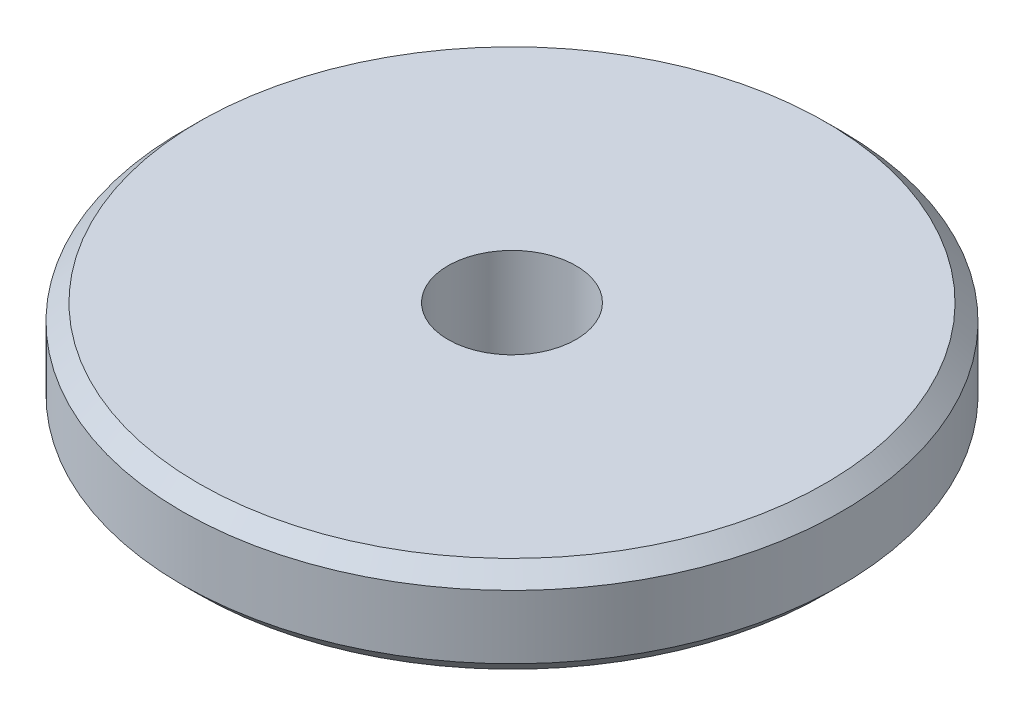
ISO-10303-21;
HEADER;
FILE_DESCRIPTION(('STEP AP214'),'2;1');
FILE_NAME('part.step','',(''),(''),'','','');
FILE_SCHEMA(('AUTOMOTIVE_DESIGN { 1 0 10303 214 1 1 1 1 }'));
ENDSEC;
DATA;
#1=APPLICATION_CONTEXT('core data for automotive mechanical design processes');
#2=APPLICATION_PROTOCOL_DEFINITION('international standard','automotive_design',2000,#1);
#3=PRODUCT_CONTEXT('',#1,'mechanical');
#4=PRODUCT('Part','Part','',(#3));
#5=PRODUCT_RELATED_PRODUCT_CATEGORY('part','',(#4));
#6=PRODUCT_DEFINITION_FORMATION('','',#4);
#7=PRODUCT_DEFINITION_CONTEXT('part definition',#1,'design');
#8=PRODUCT_DEFINITION('design','',#6,#7);
#9=PRODUCT_DEFINITION_SHAPE('','',#8);
#10=(LENGTH_UNIT() NAMED_UNIT(*) SI_UNIT(.MILLI.,.METRE.));
#11=(NAMED_UNIT(*) PLANE_ANGLE_UNIT() SI_UNIT($,.RADIAN.));
#12=(NAMED_UNIT(*) SI_UNIT($,.STERADIAN.) SOLID_ANGLE_UNIT());
#13=UNCERTAINTY_MEASURE_WITH_UNIT(LENGTH_MEASURE(1.E-05),#10,'distance_accuracy_value','');
#14=(GEOMETRIC_REPRESENTATION_CONTEXT(3) GLOBAL_UNCERTAINTY_ASSIGNED_CONTEXT((#13)) GLOBAL_UNIT_ASSIGNED_CONTEXT((#10,
#11,#12)) REPRESENTATION_CONTEXT('',''));
#15=CARTESIAN_POINT('',(0.,0.,0.));
#16=DIRECTION('',(0.,0.,1.));
#17=DIRECTION('',(1.,0.,0.));
#18=AXIS2_PLACEMENT_3D('',#15,#16,#17);
#19=CARTESIAN_POINT('',(0.,1.5,0.));
#20=DIRECTION('',(0.,1.,0.));
#21=DIRECTION('',(0.,0.,1.));
#22=AXIS2_PLACEMENT_3D('',#19,#20,#21);
#23=PLANE('',#22);
#24=CARTESIAN_POINT('',(0.,1.5,0.));
#25=DIRECTION('',(0.,1.,0.));
#26=DIRECTION('',(0.,0.,1.));
#27=AXIS2_PLACEMENT_3D('',#24,#25,#26);
#28=CIRCLE('',#27,4.896);
#29=CARTESIAN_POINT('',(0.,1.5,4.896));
#30=VERTEX_POINT('',#29);
#31=EDGE_CURVE('E57',#30,#30,#28,.T.);
#32=ORIENTED_EDGE('',*,*,#31,.T.);
#33=EDGE_LOOP('',(#32));
#34=FACE_BOUND('',#33,.T.);
#35=CARTESIAN_POINT('',(0.,1.5,0.));
#36=DIRECTION('',(0.,1.,0.));
#37=DIRECTION('',(0.,0.,1.));
#38=AXIS2_PLACEMENT_3D('',#35,#36,#37);
#39=CIRCLE('',#38,1.);
#40=CARTESIAN_POINT('',(0.,1.5,1.));
#41=VERTEX_POINT('',#40);
#42=EDGE_CURVE('E62',#41,#41,#39,.T.);
#43=ORIENTED_EDGE('',*,*,#42,.F.);
#44=EDGE_LOOP('',(#43));
#45=FACE_BOUND('',#44,.T.);
#46=ADVANCED_FACE('F41',(#34,#45),#23,.T.);
#47=CARTESIAN_POINT('',(0.,0.,0.));
#48=DIRECTION('',(0.,1.,0.));
#49=DIRECTION('',(0.,0.,1.));
#50=AXIS2_PLACEMENT_3D('',#47,#48,#49);
#51=PLANE('',#50);
#52=CARTESIAN_POINT('',(0.,0.,0.));
#53=DIRECTION('',(0.,1.,0.));
#54=DIRECTION('',(0.,0.,1.));
#55=AXIS2_PLACEMENT_3D('',#52,#53,#54);
#56=CIRCLE('',#55,4.896);
#57=CARTESIAN_POINT('',(0.,0.,4.896));
#58=VERTEX_POINT('',#57);
#59=EDGE_CURVE('E10',#58,#58,#56,.F.);
#60=ORIENTED_EDGE('',*,*,#59,.T.);
#61=EDGE_LOOP('',(#60));
#62=FACE_BOUND('',#61,.T.);
#63=CARTESIAN_POINT('',(0.,0.,0.));
#64=DIRECTION('',(0.,1.,0.));
#65=DIRECTION('',(0.,0.,1.));
#66=AXIS2_PLACEMENT_3D('',#63,#64,#65);
#67=CIRCLE('',#66,1.);
#68=CARTESIAN_POINT('',(0.,0.,1.));
#69=VERTEX_POINT('',#68);
#70=EDGE_CURVE('E63',#69,#69,#67,.T.);
#71=ORIENTED_EDGE('',*,*,#70,.T.);
#72=EDGE_LOOP('',(#71));
#73=FACE_BOUND('',#72,.T.);
#74=ADVANCED_FACE('F73',(#62,#73),#51,.F.);
#75=CARTESIAN_POINT('',(0.,1.5,0.));
#76=DIRECTION('',(0.,-1.,0.));
#77=DIRECTION('',(0.,0.,-1.));
#78=AXIS2_PLACEMENT_3D('',#75,#76,#77);
#79=CYLINDRICAL_SURFACE('',#78,5.15);
#80=CARTESIAN_POINT('',(0.,1.246,0.));
#81=DIRECTION('',(0.,1.,0.));
#82=DIRECTION('',(0.,0.,1.));
#83=AXIS2_PLACEMENT_3D('',#80,#81,#82);
#84=CIRCLE('',#83,5.15);
#85=CARTESIAN_POINT('',(0.,1.246,5.15));
#86=VERTEX_POINT('',#85);
#87=EDGE_CURVE('E49',#86,#86,#84,.F.);
#88=ORIENTED_EDGE('',*,*,#87,.T.);
#89=EDGE_LOOP('',(#88));
#90=FACE_BOUND('',#89,.T.);
#91=CARTESIAN_POINT('',(0.,0.254,0.));
#92=DIRECTION('',(0.,1.,0.));
#93=DIRECTION('',(0.,0.,1.));
#94=AXIS2_PLACEMENT_3D('',#91,#92,#93);
#95=CIRCLE('',#94,5.15);
#96=CARTESIAN_POINT('',(0.,0.254,5.15));
#97=VERTEX_POINT('',#96);
#98=EDGE_CURVE('E53',#97,#97,#95,.T.);
#99=ORIENTED_EDGE('',*,*,#98,.T.);
#100=EDGE_LOOP('',(#99));
#101=FACE_BOUND('',#100,.T.);
#102=ADVANCED_FACE('F80',(#90,#101),#79,.T.);
#103=CARTESIAN_POINT('',(0.,1.5,0.));
#104=DIRECTION('',(0.,-1.,0.));
#105=DIRECTION('',(0.,0.,-1.));
#106=AXIS2_PLACEMENT_3D('',#103,#104,#105);
#107=CYLINDRICAL_SURFACE('',#106,1.);
#108=ORIENTED_EDGE('',*,*,#42,.T.);
#109=EDGE_LOOP('',(#108));
#110=FACE_BOUND('',#109,.T.);
#111=ORIENTED_EDGE('',*,*,#70,.F.);
#112=EDGE_LOOP('',(#111));
#113=FACE_BOUND('',#112,.T.);
#114=ADVANCED_FACE('F69',(#110,#113),#107,.F.);
#115=CARTESIAN_POINT('',(0.,1.5,0.));
#116=DIRECTION('',(0.,-1.,0.));
#117=DIRECTION('',(0.,0.,-1.));
#118=AXIS2_PLACEMENT_3D('',#115,#116,#117);
#119=CONICAL_SURFACE('',#118,4.896,0.785398163397447);
#120=ORIENTED_EDGE('',*,*,#87,.F.);
#121=EDGE_LOOP('',(#120));
#122=FACE_BOUND('',#121,.T.);
#123=ORIENTED_EDGE('',*,*,#31,.F.);
#124=EDGE_LOOP('',(#123));
#125=FACE_BOUND('',#124,.T.);
#126=ADVANCED_FACE('F86',(#122,#125),#119,.T.);
#127=CARTESIAN_POINT('',(0.,0.254,0.));
#128=DIRECTION('',(0.,1.,0.));
#129=DIRECTION('',(0.,0.,1.));
#130=AXIS2_PLACEMENT_3D('',#127,#128,#129);
#131=CONICAL_SURFACE('',#130,5.15,0.78539816339745);
#132=ORIENTED_EDGE('',*,*,#59,.F.);
#133=EDGE_LOOP('',(#132));
#134=FACE_BOUND('',#133,.T.);
#135=ORIENTED_EDGE('',*,*,#98,.F.);
#136=EDGE_LOOP('',(#135));
#137=FACE_BOUND('',#136,.T.);
#138=ADVANCED_FACE('F44',(#134,#137),#131,.T.);
#139=CLOSED_SHELL('',(#46,#74,#102,#114,#126,#138));
#140=MANIFOLD_SOLID_BREP('B2',#139);
#141=ADVANCED_BREP_SHAPE_REPRESENTATION('',(#18,#140),#14);
#142=SHAPE_DEFINITION_REPRESENTATION(#9,#141);
ENDSEC;
END-ISO-10303-21;
